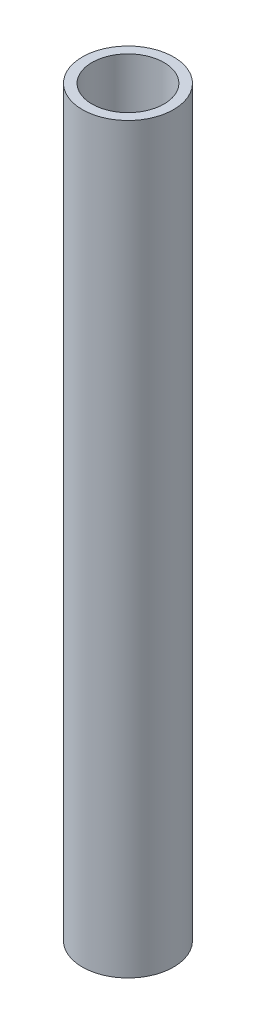
ISO-10303-21;
HEADER;
FILE_DESCRIPTION(('STEP AP214'),'2;1');
FILE_NAME('part.step','',(''),(''),'','','');
FILE_SCHEMA(('AUTOMOTIVE_DESIGN { 1 0 10303 214 1 1 1 1 }'));
ENDSEC;
DATA;
#1=APPLICATION_CONTEXT('core data for automotive mechanical design processes');
#2=APPLICATION_PROTOCOL_DEFINITION('international standard','automotive_design',2000,#1);
#3=PRODUCT_CONTEXT('',#1,'mechanical');
#4=PRODUCT('Part','Part','',(#3));
#5=PRODUCT_RELATED_PRODUCT_CATEGORY('part','',(#4));
#6=PRODUCT_DEFINITION_FORMATION('','',#4);
#7=PRODUCT_DEFINITION_CONTEXT('part definition',#1,'design');
#8=PRODUCT_DEFINITION('design','',#6,#7);
#9=PRODUCT_DEFINITION_SHAPE('','',#8);
#10=(LENGTH_UNIT() NAMED_UNIT(*) SI_UNIT(.MILLI.,.METRE.));
#11=(NAMED_UNIT(*) PLANE_ANGLE_UNIT() SI_UNIT($,.RADIAN.));
#12=(NAMED_UNIT(*) SI_UNIT($,.STERADIAN.) SOLID_ANGLE_UNIT());
#13=UNCERTAINTY_MEASURE_WITH_UNIT(LENGTH_MEASURE(1.E-05),#10,'distance_accuracy_value','');
#14=(GEOMETRIC_REPRESENTATION_CONTEXT(3) GLOBAL_UNCERTAINTY_ASSIGNED_CONTEXT((#13)) GLOBAL_UNIT_ASSIGNED_CONTEXT((#10,
#11,#12)) REPRESENTATION_CONTEXT('',''));
#15=CARTESIAN_POINT('',(0.,0.,0.));
#16=DIRECTION('',(0.,0.,1.));
#17=DIRECTION('',(1.,0.,0.));
#18=AXIS2_PLACEMENT_3D('',#15,#16,#17);
#19=CARTESIAN_POINT('',(0.,196.342,0.));
#20=DIRECTION('',(0.,1.,0.));
#21=DIRECTION('',(0.,0.,1.));
#22=AXIS2_PLACEMENT_3D('',#19,#20,#21);
#23=PLANE('',#22);
#24=CARTESIAN_POINT('',(0.,196.342,0.));
#25=DIRECTION('',(0.,1.,0.));
#26=DIRECTION('',(0.,0.,1.));
#27=AXIS2_PLACEMENT_3D('',#24,#25,#26);
#28=CIRCLE('',#27,24.13);
#29=CARTESIAN_POINT('',(0.,196.342,24.13));
#30=VERTEX_POINT('',#29);
#31=EDGE_CURVE('E10',#30,#30,#28,.T.);
#32=ORIENTED_EDGE('',*,*,#31,.T.);
#33=EDGE_LOOP('',(#32));
#34=FACE_BOUND('',#33,.T.);
#35=CARTESIAN_POINT('',(0.,196.342,0.));
#36=DIRECTION('',(0.,1.,0.));
#37=DIRECTION('',(0.,0.,1.));
#38=AXIS2_PLACEMENT_3D('',#35,#36,#37);
#39=CIRCLE('',#38,19.05);
#40=CARTESIAN_POINT('',(0.,196.342,19.05));
#41=VERTEX_POINT('',#40);
#42=EDGE_CURVE('E46',#41,#41,#39,.T.);
#43=ORIENTED_EDGE('',*,*,#42,.F.);
#44=EDGE_LOOP('',(#43));
#45=FACE_BOUND('',#44,.T.);
#46=ADVANCED_FACE('F35',(#34,#45),#23,.T.);
#47=CARTESIAN_POINT('',(0.,-196.342,0.));
#48=DIRECTION('',(0.,1.,0.));
#49=DIRECTION('',(0.,0.,1.));
#50=AXIS2_PLACEMENT_3D('',#47,#48,#49);
#51=PLANE('',#50);
#52=CARTESIAN_POINT('',(0.,-196.342,0.));
#53=DIRECTION('',(0.,1.,0.));
#54=DIRECTION('',(0.,0.,1.));
#55=AXIS2_PLACEMENT_3D('',#52,#53,#54);
#56=CIRCLE('',#55,24.13);
#57=CARTESIAN_POINT('',(0.,-196.342,24.13));
#58=VERTEX_POINT('',#57);
#59=EDGE_CURVE('E39',#58,#58,#56,.T.);
#60=ORIENTED_EDGE('',*,*,#59,.F.);
#61=EDGE_LOOP('',(#60));
#62=FACE_BOUND('',#61,.T.);
#63=CARTESIAN_POINT('',(0.,-196.342,0.));
#64=DIRECTION('',(0.,1.,0.));
#65=DIRECTION('',(0.,0.,1.));
#66=AXIS2_PLACEMENT_3D('',#63,#64,#65);
#67=CIRCLE('',#66,19.05);
#68=CARTESIAN_POINT('',(0.,-196.342,19.05));
#69=VERTEX_POINT('',#68);
#70=EDGE_CURVE('E48',#69,#69,#67,.T.);
#71=ORIENTED_EDGE('',*,*,#70,.T.);
#72=EDGE_LOOP('',(#71));
#73=FACE_BOUND('',#72,.T.);
#74=ADVANCED_FACE('F58',(#62,#73),#51,.F.);
#75=CARTESIAN_POINT('',(0.,196.342,0.));
#76=DIRECTION('',(0.,-1.,0.));
#77=DIRECTION('',(0.,0.,-1.));
#78=AXIS2_PLACEMENT_3D('',#75,#76,#77);
#79=CYLINDRICAL_SURFACE('',#78,24.13);
#80=ORIENTED_EDGE('',*,*,#31,.F.);
#81=EDGE_LOOP('',(#80));
#82=FACE_BOUND('',#81,.T.);
#83=ORIENTED_EDGE('',*,*,#59,.T.);
#84=EDGE_LOOP('',(#83));
#85=FACE_BOUND('',#84,.T.);
#86=ADVANCED_FACE('F37',(#82,#85),#79,.T.);
#87=CARTESIAN_POINT('',(0.,196.342,0.));
#88=DIRECTION('',(0.,-1.,0.));
#89=DIRECTION('',(0.,0.,-1.));
#90=AXIS2_PLACEMENT_3D('',#87,#88,#89);
#91=CYLINDRICAL_SURFACE('',#90,19.05);
#92=ORIENTED_EDGE('',*,*,#42,.T.);
#93=EDGE_LOOP('',(#92));
#94=FACE_BOUND('',#93,.T.);
#95=ORIENTED_EDGE('',*,*,#70,.F.);
#96=EDGE_LOOP('',(#95));
#97=FACE_BOUND('',#96,.T.);
#98=ADVANCED_FACE('F54',(#94,#97),#91,.F.);
#99=CLOSED_SHELL('',(#46,#74,#86,#98));
#100=MANIFOLD_SOLID_BREP('B2',#99);
#101=ADVANCED_BREP_SHAPE_REPRESENTATION('',(#18,#100),#14);
#102=SHAPE_DEFINITION_REPRESENTATION(#9,#101);
ENDSEC;
END-ISO-10303-21;
